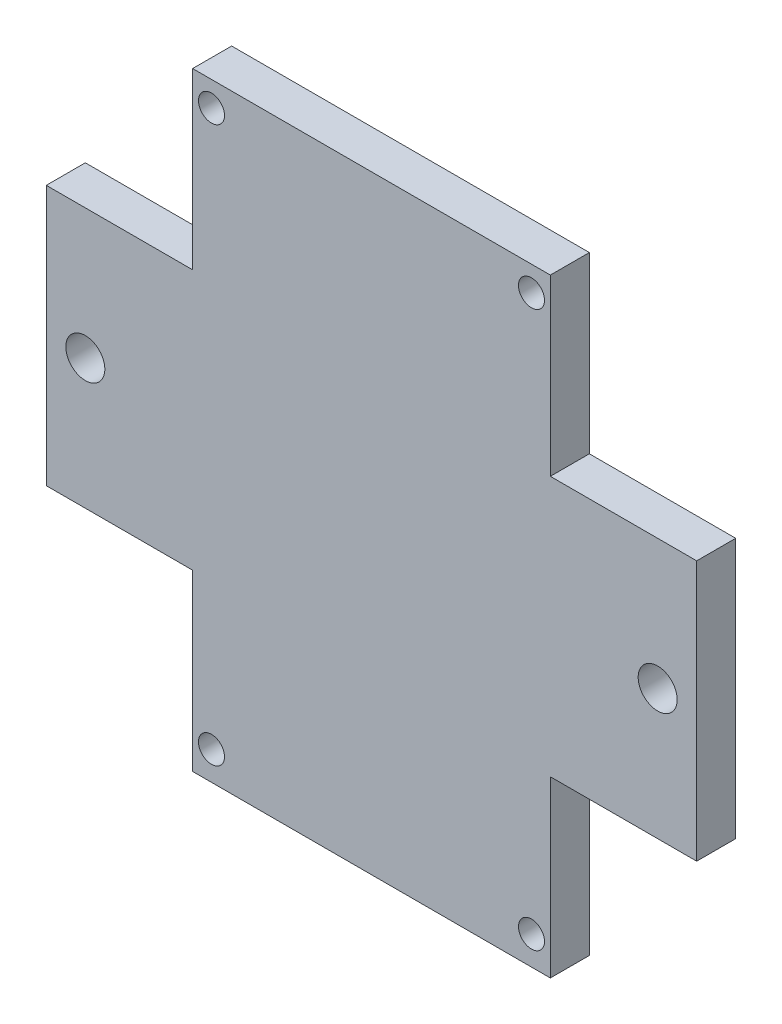
ISO-10303-21;
HEADER;
FILE_DESCRIPTION(('STEP AP214'),'2;1');
FILE_NAME('part.step','',(''),(''),'','','');
FILE_SCHEMA(('AUTOMOTIVE_DESIGN { 1 0 10303 214 1 1 1 1 }'));
ENDSEC;
DATA;
#1=APPLICATION_CONTEXT('core data for automotive mechanical design processes');
#2=APPLICATION_PROTOCOL_DEFINITION('international standard','automotive_design',2000,#1);
#3=PRODUCT_CONTEXT('',#1,'mechanical');
#4=PRODUCT('Part','Part','',(#3));
#5=PRODUCT_RELATED_PRODUCT_CATEGORY('part','',(#4));
#6=PRODUCT_DEFINITION_FORMATION('','',#4);
#7=PRODUCT_DEFINITION_CONTEXT('part definition',#1,'design');
#8=PRODUCT_DEFINITION('design','',#6,#7);
#9=PRODUCT_DEFINITION_SHAPE('','',#8);
#10=(LENGTH_UNIT() NAMED_UNIT(*) SI_UNIT(.MILLI.,.METRE.));
#11=(NAMED_UNIT(*) PLANE_ANGLE_UNIT() SI_UNIT($,.RADIAN.));
#12=(NAMED_UNIT(*) SI_UNIT($,.STERADIAN.) SOLID_ANGLE_UNIT());
#13=UNCERTAINTY_MEASURE_WITH_UNIT(LENGTH_MEASURE(1.E-05),#10,'distance_accuracy_value','');
#14=(GEOMETRIC_REPRESENTATION_CONTEXT(3) GLOBAL_UNCERTAINTY_ASSIGNED_CONTEXT((#13)) GLOBAL_UNIT_ASSIGNED_CONTEXT((#10,
#11,#12)) REPRESENTATION_CONTEXT('',''));
#15=CARTESIAN_POINT('',(0.,0.,0.));
#16=DIRECTION('',(0.,0.,1.));
#17=DIRECTION('',(1.,0.,0.));
#18=AXIS2_PLACEMENT_3D('',#15,#16,#17);
#19=CARTESIAN_POINT('',(13.75,46.8,-1.5));
#20=DIRECTION('',(-1.,0.,0.));
#21=DIRECTION('',(0.,0.,1.));
#22=AXIS2_PLACEMENT_3D('',#19,#20,#21);
#23=PLANE('',#22);
#24=DIRECTION('',(0.,-1.,0.));
#25=VECTOR('',#24,1.);
#26=CARTESIAN_POINT('',(13.75,46.8,1.5));
#27=LINE('',#26,#25);
#28=CARTESIAN_POINT('',(13.75,46.8,1.5));
#29=VERTEX_POINT('',#28);
#30=CARTESIAN_POINT('',(13.75,33.4,1.5));
#31=VERTEX_POINT('',#30);
#32=EDGE_CURVE('E225',#29,#31,#27,.T.);
#33=ORIENTED_EDGE('',*,*,#32,.T.);
#34=DIRECTION('',(0.,0.,-1.));
#35=VECTOR('',#34,1.);
#36=CARTESIAN_POINT('',(13.75,33.4,-1.5));
#37=LINE('',#36,#35);
#38=CARTESIAN_POINT('',(13.75,33.4,-1.5));
#39=VERTEX_POINT('',#38);
#40=EDGE_CURVE('E188',#31,#39,#37,.T.);
#41=ORIENTED_EDGE('',*,*,#40,.T.);
#42=DIRECTION('',(0.,-1.,0.));
#43=VECTOR('',#42,1.);
#44=CARTESIAN_POINT('',(13.75,46.8,-1.5));
#45=LINE('',#44,#43);
#46=CARTESIAN_POINT('',(13.75,46.8,-1.5));
#47=VERTEX_POINT('',#46);
#48=EDGE_CURVE('E11',#47,#39,#45,.T.);
#49=ORIENTED_EDGE('',*,*,#48,.F.);
#50=DIRECTION('',(0.,0.,-1.));
#51=VECTOR('',#50,1.);
#52=CARTESIAN_POINT('',(13.75,46.8,-1.5));
#53=LINE('',#52,#51);
#54=EDGE_CURVE('E204',#29,#47,#53,.T.);
#55=ORIENTED_EDGE('',*,*,#54,.F.);
#56=EDGE_LOOP('',(#33,#41,#49,#55));
#57=FACE_BOUND('',#56,.T.);
#58=ADVANCED_FACE('F38',(#57),#23,.F.);
#59=CARTESIAN_POINT('',(-13.75,46.8,-1.5));
#60=DIRECTION('',(1.,0.,0.));
#61=DIRECTION('',(0.,0.,-1.));
#62=AXIS2_PLACEMENT_3D('',#59,#60,#61);
#63=PLANE('',#62);
#64=DIRECTION('',(0.,-1.,0.));
#65=VECTOR('',#64,1.);
#66=CARTESIAN_POINT('',(-13.75,46.8,-1.5));
#67=LINE('',#66,#65);
#68=CARTESIAN_POINT('',(-13.75,46.8,-1.5));
#69=VERTEX_POINT('',#68);
#70=CARTESIAN_POINT('',(-13.75,33.4,-1.5));
#71=VERTEX_POINT('',#70);
#72=EDGE_CURVE('E233',#69,#71,#67,.T.);
#73=ORIENTED_EDGE('',*,*,#72,.T.);
#74=DIRECTION('',(0.,0.,1.));
#75=VECTOR('',#74,1.);
#76=CARTESIAN_POINT('',(-13.75,33.4,-1.5));
#77=LINE('',#76,#75);
#78=CARTESIAN_POINT('',(-13.75,33.4,1.5));
#79=VERTEX_POINT('',#78);
#80=EDGE_CURVE('E185',#71,#79,#77,.T.);
#81=ORIENTED_EDGE('',*,*,#80,.T.);
#82=DIRECTION('',(0.,-1.,0.));
#83=VECTOR('',#82,1.);
#84=CARTESIAN_POINT('',(-13.75,46.8,1.5));
#85=LINE('',#84,#83);
#86=CARTESIAN_POINT('',(-13.75,46.8,1.5));
#87=VERTEX_POINT('',#86);
#88=EDGE_CURVE('E229',#87,#79,#85,.T.);
#89=ORIENTED_EDGE('',*,*,#88,.F.);
#90=DIRECTION('',(0.,0.,1.));
#91=VECTOR('',#90,1.);
#92=CARTESIAN_POINT('',(-13.75,46.8,-1.5));
#93=LINE('',#92,#91);
#94=EDGE_CURVE('E210',#69,#87,#93,.T.);
#95=ORIENTED_EDGE('',*,*,#94,.F.);
#96=EDGE_LOOP('',(#73,#81,#89,#95));
#97=FACE_BOUND('',#96,.T.);
#98=ADVANCED_FACE('F294',(#97),#63,.F.);
#99=CARTESIAN_POINT('',(13.75,13.4,-1.5));
#100=VERTEX_POINT('',#99);
#101=CARTESIAN_POINT('',(13.75,0.,-1.5));
#102=VERTEX_POINT('',#101);
#103=EDGE_CURVE('E47',#100,#102,#45,.T.);
#104=ORIENTED_EDGE('',*,*,#103,.F.);
#105=DIRECTION('',(0.,0.,1.));
#106=VECTOR('',#105,1.);
#107=CARTESIAN_POINT('',(13.75,13.4,-1.5));
#108=LINE('',#107,#106);
#109=CARTESIAN_POINT('',(13.75,13.4,1.5));
#110=VERTEX_POINT('',#109);
#111=EDGE_CURVE('E183',#100,#110,#108,.T.);
#112=ORIENTED_EDGE('',*,*,#111,.T.);
#113=CARTESIAN_POINT('',(13.75,0.,1.5));
#114=VERTEX_POINT('',#113);
#115=EDGE_CURVE('E135',#110,#114,#27,.T.);
#116=ORIENTED_EDGE('',*,*,#115,.T.);
#117=DIRECTION('',(0.,0.,-1.));
#118=VECTOR('',#117,1.);
#119=CARTESIAN_POINT('',(13.75,0.,-1.5));
#120=LINE('',#119,#118);
#121=EDGE_CURVE('E214',#114,#102,#120,.T.);
#122=ORIENTED_EDGE('',*,*,#121,.T.);
#123=EDGE_LOOP('',(#104,#112,#116,#122));
#124=FACE_BOUND('',#123,.T.);
#125=ADVANCED_FACE('F40',(#124),#23,.F.);
#126=CARTESIAN_POINT('',(-13.75,46.8,-1.5));
#127=DIRECTION('',(0.,0.,1.));
#128=DIRECTION('',(1.,0.,0.));
#129=AXIS2_PLACEMENT_3D('',#126,#127,#128);
#130=PLANE('',#129);
#131=CARTESIAN_POINT('',(22.,23.4,-1.5));
#132=DIRECTION('',(0.,0.,-1.));
#133=DIRECTION('',(-1.,0.,0.));
#134=AXIS2_PLACEMENT_3D('',#131,#132,#133);
#135=CIRCLE('',#134,1.5);
#136=CARTESIAN_POINT('',(20.5,23.4,-1.5));
#137=VERTEX_POINT('',#136);
#138=EDGE_CURVE('E246',#137,#137,#135,.T.);
#139=ORIENTED_EDGE('',*,*,#138,.F.);
#140=EDGE_LOOP('',(#139));
#141=FACE_BOUND('',#140,.T.);
#142=CARTESIAN_POINT('',(-22.,23.4,-1.5));
#143=DIRECTION('',(0.,0.,-1.));
#144=DIRECTION('',(-1.,0.,0.));
#145=AXIS2_PLACEMENT_3D('',#142,#143,#144);
#146=CIRCLE('',#145,1.5);
#147=CARTESIAN_POINT('',(-23.5,23.4,-1.5));
#148=VERTEX_POINT('',#147);
#149=EDGE_CURVE('E157',#148,#148,#146,.T.);
#150=ORIENTED_EDGE('',*,*,#149,.F.);
#151=EDGE_LOOP('',(#150));
#152=FACE_BOUND('',#151,.T.);
#153=CARTESIAN_POINT('',(-12.3,2.2,-1.5));
#154=DIRECTION('',(0.,0.,-1.));
#155=DIRECTION('',(1.,0.,0.));
#156=AXIS2_PLACEMENT_3D('',#153,#154,#155);
#157=CIRCLE('',#156,1.);
#158=CARTESIAN_POINT('',(-11.3,2.2,-1.5));
#159=VERTEX_POINT('',#158);
#160=EDGE_CURVE('E196',#159,#159,#157,.T.);
#161=ORIENTED_EDGE('',*,*,#160,.F.);
#162=EDGE_LOOP('',(#161));
#163=FACE_BOUND('',#162,.T.);
#164=CARTESIAN_POINT('',(12.3,2.2,-1.5));
#165=DIRECTION('',(0.,0.,-1.));
#166=DIRECTION('',(-1.,0.,0.));
#167=AXIS2_PLACEMENT_3D('',#164,#165,#166);
#168=CIRCLE('',#167,1.);
#169=CARTESIAN_POINT('',(11.3,2.2,-1.5));
#170=VERTEX_POINT('',#169);
#171=EDGE_CURVE('E192',#170,#170,#168,.T.);
#172=ORIENTED_EDGE('',*,*,#171,.F.);
#173=EDGE_LOOP('',(#172));
#174=FACE_BOUND('',#173,.T.);
#175=CARTESIAN_POINT('',(-13.75,13.4,-1.5));
#176=VERTEX_POINT('',#175);
#177=CARTESIAN_POINT('',(-13.75,0.,-1.5));
#178=VERTEX_POINT('',#177);
#179=EDGE_CURVE('E232',#176,#178,#67,.T.);
#180=ORIENTED_EDGE('',*,*,#179,.F.);
#181=DIRECTION('',(1.,0.,0.));
#182=VECTOR('',#181,1.);
#183=CARTESIAN_POINT('',(-25.,13.4,-1.5));
#184=LINE('',#183,#182);
#185=CARTESIAN_POINT('',(-25.,13.4,-1.5));
#186=VERTEX_POINT('',#185);
#187=EDGE_CURVE('E55',#186,#176,#184,.T.);
#188=ORIENTED_EDGE('',*,*,#187,.F.);
#189=DIRECTION('',(0.,1.,0.));
#190=VECTOR('',#189,1.);
#191=CARTESIAN_POINT('',(-25.,33.4,-1.5));
#192=LINE('',#191,#190);
#193=CARTESIAN_POINT('',(-25.,33.4,-1.5));
#194=VERTEX_POINT('',#193);
#195=EDGE_CURVE('E167',#186,#194,#192,.T.);
#196=ORIENTED_EDGE('',*,*,#195,.T.);
#197=DIRECTION('',(1.,0.,0.));
#198=VECTOR('',#197,1.);
#199=CARTESIAN_POINT('',(-25.,33.4,-1.5));
#200=LINE('',#199,#198);
#201=EDGE_CURVE('E176',#194,#71,#200,.T.);
#202=ORIENTED_EDGE('',*,*,#201,.T.);
#203=ORIENTED_EDGE('',*,*,#72,.F.);
#204=DIRECTION('',(-1.,0.,0.));
#205=VECTOR('',#204,1.);
#206=CARTESIAN_POINT('',(-13.75,46.8,-1.5));
#207=LINE('',#206,#205);
#208=EDGE_CURVE('E207',#47,#69,#207,.T.);
#209=ORIENTED_EDGE('',*,*,#208,.F.);
#210=ORIENTED_EDGE('',*,*,#48,.T.);
#211=CARTESIAN_POINT('',(25.,33.4,-1.5));
#212=VERTEX_POINT('',#211);
#213=EDGE_CURVE('E179',#39,#212,#200,.T.);
#214=ORIENTED_EDGE('',*,*,#213,.T.);
#215=DIRECTION('',(0.,1.,0.));
#216=VECTOR('',#215,1.);
#217=CARTESIAN_POINT('',(25.,33.4,-1.5));
#218=LINE('',#217,#216);
#219=CARTESIAN_POINT('',(25.,13.4,-1.5));
#220=VERTEX_POINT('',#219);
#221=EDGE_CURVE('E147',#220,#212,#218,.T.);
#222=ORIENTED_EDGE('',*,*,#221,.F.);
#223=EDGE_CURVE('E143',#100,#220,#184,.T.);
#224=ORIENTED_EDGE('',*,*,#223,.F.);
#225=ORIENTED_EDGE('',*,*,#103,.T.);
#226=DIRECTION('',(-1.,0.,0.));
#227=VECTOR('',#226,1.);
#228=CARTESIAN_POINT('',(-13.75,0.,-1.5));
#229=LINE('',#228,#227);
#230=EDGE_CURVE('E217',#102,#178,#229,.T.);
#231=ORIENTED_EDGE('',*,*,#230,.T.);
#232=EDGE_LOOP('',(#180,#188,#196,#202,#203,#209,#210,#214,#222,#224,#225,#231));
#233=FACE_BOUND('',#232,.T.);
#234=CARTESIAN_POINT('',(12.3,44.8931165616626,-1.5));
#235=DIRECTION('',(0.,0.,-1.));
#236=DIRECTION('',(-1.,0.,0.));
#237=AXIS2_PLACEMENT_3D('',#234,#235,#236);
#238=CIRCLE('',#237,1.);
#239=CARTESIAN_POINT('',(11.3,44.8931165616626,-1.5));
#240=VERTEX_POINT('',#239);
#241=EDGE_CURVE('E195',#240,#240,#238,.T.);
#242=ORIENTED_EDGE('',*,*,#241,.F.);
#243=EDGE_LOOP('',(#242));
#244=FACE_BOUND('',#243,.T.);
#245=CARTESIAN_POINT('',(-12.3,44.8931165616626,-1.5));
#246=DIRECTION('',(0.,0.,-1.));
#247=DIRECTION('',(1.,0.,0.));
#248=AXIS2_PLACEMENT_3D('',#245,#246,#247);
#249=CIRCLE('',#248,1.);
#250=CARTESIAN_POINT('',(-11.3,44.8931165616626,-1.5));
#251=VERTEX_POINT('',#250);
#252=EDGE_CURVE('E191',#251,#251,#249,.T.);
#253=ORIENTED_EDGE('',*,*,#252,.F.);
#254=EDGE_LOOP('',(#253));
#255=FACE_BOUND('',#254,.T.);
#256=ADVANCED_FACE('F258',(#141,#152,#163,#174,#233,#244,#255),#130,.F.);
#257=CARTESIAN_POINT('',(-13.75,13.4,1.5));
#258=VERTEX_POINT('',#257);
#259=CARTESIAN_POINT('',(-13.75,0.,1.5));
#260=VERTEX_POINT('',#259);
#261=EDGE_CURVE('E228',#258,#260,#85,.T.);
#262=ORIENTED_EDGE('',*,*,#261,.F.);
#263=DIRECTION('',(0.,0.,-1.));
#264=VECTOR('',#263,1.);
#265=CARTESIAN_POINT('',(-13.75,13.4,-1.5));
#266=LINE('',#265,#264);
#267=EDGE_CURVE('E174',#258,#176,#266,.T.);
#268=ORIENTED_EDGE('',*,*,#267,.T.);
#269=ORIENTED_EDGE('',*,*,#179,.T.);
#270=DIRECTION('',(0.,0.,1.));
#271=VECTOR('',#270,1.);
#272=CARTESIAN_POINT('',(-13.75,0.,-1.5));
#273=LINE('',#272,#271);
#274=EDGE_CURVE('E221',#178,#260,#273,.T.);
#275=ORIENTED_EDGE('',*,*,#274,.T.);
#276=EDGE_LOOP('',(#262,#268,#269,#275));
#277=FACE_BOUND('',#276,.T.);
#278=ADVANCED_FACE('F261',(#277),#63,.F.);
#279=CARTESIAN_POINT('',(-13.75,46.8,1.5));
#280=DIRECTION('',(0.,0.,-1.));
#281=DIRECTION('',(-1.,0.,0.));
#282=AXIS2_PLACEMENT_3D('',#279,#280,#281);
#283=PLANE('',#282);
#284=CARTESIAN_POINT('',(22.,23.4,1.5));
#285=DIRECTION('',(0.,0.,-1.));
#286=DIRECTION('',(-1.,0.,0.));
#287=AXIS2_PLACEMENT_3D('',#284,#285,#286);
#288=CIRCLE('',#287,1.5);
#289=CARTESIAN_POINT('',(20.5,23.4,1.5));
#290=VERTEX_POINT('',#289);
#291=EDGE_CURVE('E42',#290,#290,#288,.T.);
#292=ORIENTED_EDGE('',*,*,#291,.T.);
#293=EDGE_LOOP('',(#292));
#294=FACE_BOUND('',#293,.T.);
#295=CARTESIAN_POINT('',(-22.,23.4,1.5));
#296=DIRECTION('',(0.,0.,-1.));
#297=DIRECTION('',(-1.,0.,0.));
#298=AXIS2_PLACEMENT_3D('',#295,#296,#297);
#299=CIRCLE('',#298,1.5);
#300=CARTESIAN_POINT('',(-23.5,23.4,1.5));
#301=VERTEX_POINT('',#300);
#302=EDGE_CURVE('E155',#301,#301,#299,.T.);
#303=ORIENTED_EDGE('',*,*,#302,.T.);
#304=EDGE_LOOP('',(#303));
#305=FACE_BOUND('',#304,.T.);
#306=CARTESIAN_POINT('',(-12.3,2.2,1.5));
#307=DIRECTION('',(0.,0.,-1.));
#308=DIRECTION('',(-1.,0.,0.));
#309=AXIS2_PLACEMENT_3D('',#306,#307,#308);
#310=CIRCLE('',#309,1.);
#311=CARTESIAN_POINT('',(-13.3,2.2,1.5));
#312=VERTEX_POINT('',#311);
#313=EDGE_CURVE('E241',#312,#312,#310,.T.);
#314=ORIENTED_EDGE('',*,*,#313,.T.);
#315=EDGE_LOOP('',(#314));
#316=FACE_BOUND('',#315,.T.);
#317=CARTESIAN_POINT('',(12.3,2.2,1.5));
#318=DIRECTION('',(0.,0.,-1.));
#319=DIRECTION('',(-1.,0.,0.));
#320=AXIS2_PLACEMENT_3D('',#317,#318,#319);
#321=CIRCLE('',#320,1.);
#322=CARTESIAN_POINT('',(11.3,2.2,1.5));
#323=VERTEX_POINT('',#322);
#324=EDGE_CURVE('E238',#323,#323,#321,.T.);
#325=ORIENTED_EDGE('',*,*,#324,.T.);
#326=EDGE_LOOP('',(#325));
#327=FACE_BOUND('',#326,.T.);
#328=ORIENTED_EDGE('',*,*,#115,.F.);
#329=DIRECTION('',(1.,0.,0.));
#330=VECTOR('',#329,1.);
#331=CARTESIAN_POINT('',(-25.,13.4,1.5));
#332=LINE('',#331,#330);
#333=CARTESIAN_POINT('',(25.,13.4,1.5));
#334=VERTEX_POINT('',#333);
#335=EDGE_CURVE('E63',#110,#334,#332,.T.);
#336=ORIENTED_EDGE('',*,*,#335,.T.);
#337=DIRECTION('',(0.,-1.,0.));
#338=VECTOR('',#337,1.);
#339=CARTESIAN_POINT('',(25.,33.4,1.5));
#340=LINE('',#339,#338);
#341=CARTESIAN_POINT('',(25.,33.4,1.5));
#342=VERTEX_POINT('',#341);
#343=EDGE_CURVE('E133',#342,#334,#340,.T.);
#344=ORIENTED_EDGE('',*,*,#343,.F.);
#345=DIRECTION('',(1.,0.,0.));
#346=VECTOR('',#345,1.);
#347=CARTESIAN_POINT('',(-25.,33.4,1.5));
#348=LINE('',#347,#346);
#349=EDGE_CURVE('E175',#31,#342,#348,.T.);
#350=ORIENTED_EDGE('',*,*,#349,.F.);
#351=ORIENTED_EDGE('',*,*,#32,.F.);
#352=DIRECTION('',(1.,0.,0.));
#353=VECTOR('',#352,1.);
#354=CARTESIAN_POINT('',(-13.75,46.8,1.5));
#355=LINE('',#354,#353);
#356=EDGE_CURVE('E212',#87,#29,#355,.T.);
#357=ORIENTED_EDGE('',*,*,#356,.F.);
#358=ORIENTED_EDGE('',*,*,#88,.T.);
#359=CARTESIAN_POINT('',(-25.,33.4,1.5));
#360=VERTEX_POINT('',#359);
#361=EDGE_CURVE('E172',#360,#79,#348,.T.);
#362=ORIENTED_EDGE('',*,*,#361,.F.);
#363=DIRECTION('',(0.,-1.,0.));
#364=VECTOR('',#363,1.);
#365=CARTESIAN_POINT('',(-25.,33.4,1.5));
#366=LINE('',#365,#364);
#367=CARTESIAN_POINT('',(-25.,13.4,1.5));
#368=VERTEX_POINT('',#367);
#369=EDGE_CURVE('E162',#360,#368,#366,.T.);
#370=ORIENTED_EDGE('',*,*,#369,.T.);
#371=EDGE_CURVE('E136',#368,#258,#332,.T.);
#372=ORIENTED_EDGE('',*,*,#371,.T.);
#373=ORIENTED_EDGE('',*,*,#261,.T.);
#374=DIRECTION('',(1.,0.,0.));
#375=VECTOR('',#374,1.);
#376=CARTESIAN_POINT('',(-13.75,0.,1.5));
#377=LINE('',#376,#375);
#378=EDGE_CURVE('E208',#260,#114,#377,.T.);
#379=ORIENTED_EDGE('',*,*,#378,.T.);
#380=EDGE_LOOP('',(#328,#336,#344,#350,#351,#357,#358,#362,#370,#372,#373,#379));
#381=FACE_BOUND('',#380,.T.);
#382=CARTESIAN_POINT('',(12.3,44.8931165616626,1.5));
#383=DIRECTION('',(0.,0.,-1.));
#384=DIRECTION('',(-1.,0.,0.));
#385=AXIS2_PLACEMENT_3D('',#382,#383,#384);
#386=CIRCLE('',#385,1.);
#387=CARTESIAN_POINT('',(11.3,44.8931165616626,1.5));
#388=VERTEX_POINT('',#387);
#389=EDGE_CURVE('E203',#388,#388,#386,.T.);
#390=ORIENTED_EDGE('',*,*,#389,.T.);
#391=EDGE_LOOP('',(#390));
#392=FACE_BOUND('',#391,.T.);
#393=CARTESIAN_POINT('',(-12.3,44.8931165616626,1.5));
#394=DIRECTION('',(0.,0.,-1.));
#395=DIRECTION('',(-1.,0.,0.));
#396=AXIS2_PLACEMENT_3D('',#393,#394,#395);
#397=CIRCLE('',#396,1.);
#398=CARTESIAN_POINT('',(-13.3,44.8931165616626,1.5));
#399=VERTEX_POINT('',#398);
#400=EDGE_CURVE('E218',#399,#399,#397,.T.);
#401=ORIENTED_EDGE('',*,*,#400,.T.);
#402=EDGE_LOOP('',(#401));
#403=FACE_BOUND('',#402,.T.);
#404=ADVANCED_FACE('F129',(#294,#305,#316,#327,#381,#392,#403),#283,.F.);
#405=CARTESIAN_POINT('',(0.,46.8,0.));
#406=DIRECTION('',(0.,1.,0.));
#407=DIRECTION('',(0.,0.,1.));
#408=AXIS2_PLACEMENT_3D('',#405,#406,#407);
#409=PLANE('',#408);
#410=ORIENTED_EDGE('',*,*,#54,.T.);
#411=ORIENTED_EDGE('',*,*,#208,.T.);
#412=ORIENTED_EDGE('',*,*,#94,.T.);
#413=ORIENTED_EDGE('',*,*,#356,.T.);
#414=EDGE_LOOP('',(#410,#411,#412,#413));
#415=FACE_BOUND('',#414,.T.);
#416=ADVANCED_FACE('F282',(#415),#409,.T.);
#417=CARTESIAN_POINT('',(0.,0.,0.));
#418=DIRECTION('',(0.,1.,0.));
#419=DIRECTION('',(0.,0.,1.));
#420=AXIS2_PLACEMENT_3D('',#417,#418,#419);
#421=PLANE('',#420);
#422=ORIENTED_EDGE('',*,*,#121,.F.);
#423=ORIENTED_EDGE('',*,*,#378,.F.);
#424=ORIENTED_EDGE('',*,*,#274,.F.);
#425=ORIENTED_EDGE('',*,*,#230,.F.);
#426=EDGE_LOOP('',(#422,#423,#424,#425));
#427=FACE_BOUND('',#426,.T.);
#428=ADVANCED_FACE('F289',(#427),#421,.F.);
#429=CARTESIAN_POINT('',(12.3,44.8931165616626,45.3));
#430=DIRECTION('',(0.,0.,-1.));
#431=DIRECTION('',(-1.,0.,0.));
#432=AXIS2_PLACEMENT_3D('',#429,#430,#431);
#433=CYLINDRICAL_SURFACE('',#432,1.);
#434=ORIENTED_EDGE('',*,*,#241,.T.);
#435=EDGE_LOOP('',(#434));
#436=FACE_BOUND('',#435,.T.);
#437=ORIENTED_EDGE('',*,*,#389,.F.);
#438=EDGE_LOOP('',(#437));
#439=FACE_BOUND('',#438,.T.);
#440=ADVANCED_FACE('F343',(#436,#439),#433,.F.);
#441=CARTESIAN_POINT('',(12.3,2.2,45.3));
#442=DIRECTION('',(0.,0.,-1.));
#443=DIRECTION('',(-1.,0.,0.));
#444=AXIS2_PLACEMENT_3D('',#441,#442,#443);
#445=CYLINDRICAL_SURFACE('',#444,1.);
#446=ORIENTED_EDGE('',*,*,#171,.T.);
#447=EDGE_LOOP('',(#446));
#448=FACE_BOUND('',#447,.T.);
#449=ORIENTED_EDGE('',*,*,#324,.F.);
#450=EDGE_LOOP('',(#449));
#451=FACE_BOUND('',#450,.T.);
#452=ADVANCED_FACE('F340',(#448,#451),#445,.F.);
#453=CARTESIAN_POINT('',(-12.3,2.2,45.3));
#454=DIRECTION('',(0.,0.,-1.));
#455=DIRECTION('',(-1.,0.,0.));
#456=AXIS2_PLACEMENT_3D('',#453,#454,#455);
#457=CYLINDRICAL_SURFACE('',#456,1.);
#458=ORIENTED_EDGE('',*,*,#160,.T.);
#459=EDGE_LOOP('',(#458));
#460=FACE_BOUND('',#459,.T.);
#461=ORIENTED_EDGE('',*,*,#313,.F.);
#462=EDGE_LOOP('',(#461));
#463=FACE_BOUND('',#462,.T.);
#464=ADVANCED_FACE('F277',(#460,#463),#457,.F.);
#465=CARTESIAN_POINT('',(-12.3,44.8931165616626,45.3));
#466=DIRECTION('',(0.,0.,-1.));
#467=DIRECTION('',(-1.,0.,0.));
#468=AXIS2_PLACEMENT_3D('',#465,#466,#467);
#469=CYLINDRICAL_SURFACE('',#468,1.);
#470=ORIENTED_EDGE('',*,*,#252,.T.);
#471=EDGE_LOOP('',(#470));
#472=FACE_BOUND('',#471,.T.);
#473=ORIENTED_EDGE('',*,*,#400,.F.);
#474=EDGE_LOOP('',(#473));
#475=FACE_BOUND('',#474,.T.);
#476=ADVANCED_FACE('F273',(#472,#475),#469,.F.);
#477=CARTESIAN_POINT('',(-25.,0.,0.));
#478=DIRECTION('',(1.,0.,0.));
#479=DIRECTION('',(0.,0.,-1.));
#480=AXIS2_PLACEMENT_3D('',#477,#478,#479);
#481=PLANE('',#480);
#482=ORIENTED_EDGE('',*,*,#369,.F.);
#483=DIRECTION('',(0.,0.,1.));
#484=VECTOR('',#483,1.);
#485=CARTESIAN_POINT('',(-25.,33.4,1.5));
#486=LINE('',#485,#484);
#487=EDGE_CURVE('E137',#194,#360,#486,.T.);
#488=ORIENTED_EDGE('',*,*,#487,.F.);
#489=ORIENTED_EDGE('',*,*,#195,.F.);
#490=DIRECTION('',(0.,0.,-1.));
#491=VECTOR('',#490,1.);
#492=CARTESIAN_POINT('',(-25.,13.4,1.5));
#493=LINE('',#492,#491);
#494=EDGE_CURVE('E165',#368,#186,#493,.T.);
#495=ORIENTED_EDGE('',*,*,#494,.F.);
#496=EDGE_LOOP('',(#482,#488,#489,#495));
#497=FACE_BOUND('',#496,.T.);
#498=ADVANCED_FACE('F276',(#497),#481,.F.);
#499=CARTESIAN_POINT('',(-25.,13.4,1.5));
#500=DIRECTION('',(0.,-1.,0.));
#501=DIRECTION('',(0.,0.,-1.));
#502=AXIS2_PLACEMENT_3D('',#499,#500,#501);
#503=PLANE('',#502);
#504=ORIENTED_EDGE('',*,*,#267,.F.);
#505=ORIENTED_EDGE('',*,*,#371,.F.);
#506=ORIENTED_EDGE('',*,*,#494,.T.);
#507=ORIENTED_EDGE('',*,*,#187,.T.);
#508=EDGE_LOOP('',(#504,#505,#506,#507));
#509=FACE_BOUND('',#508,.T.);
#510=ADVANCED_FACE('F313',(#509),#503,.T.);
#511=CARTESIAN_POINT('',(-25.,33.4,1.5));
#512=DIRECTION('',(0.,1.,0.));
#513=DIRECTION('',(0.,0.,1.));
#514=AXIS2_PLACEMENT_3D('',#511,#512,#513);
#515=PLANE('',#514);
#516=ORIENTED_EDGE('',*,*,#80,.F.);
#517=ORIENTED_EDGE('',*,*,#201,.F.);
#518=ORIENTED_EDGE('',*,*,#487,.T.);
#519=ORIENTED_EDGE('',*,*,#361,.T.);
#520=EDGE_LOOP('',(#516,#517,#518,#519));
#521=FACE_BOUND('',#520,.T.);
#522=ADVANCED_FACE('F320',(#521),#515,.T.);
#523=ORIENTED_EDGE('',*,*,#40,.F.);
#524=ORIENTED_EDGE('',*,*,#349,.T.);
#525=DIRECTION('',(0.,0.,1.));
#526=VECTOR('',#525,1.);
#527=CARTESIAN_POINT('',(25.,33.4,1.5));
#528=LINE('',#527,#526);
#529=EDGE_CURVE('E152',#212,#342,#528,.T.);
#530=ORIENTED_EDGE('',*,*,#529,.F.);
#531=ORIENTED_EDGE('',*,*,#213,.F.);
#532=EDGE_LOOP('',(#523,#524,#530,#531));
#533=FACE_BOUND('',#532,.T.);
#534=ADVANCED_FACE('F329',(#533),#515,.T.);
#535=ORIENTED_EDGE('',*,*,#111,.F.);
#536=ORIENTED_EDGE('',*,*,#223,.T.);
#537=DIRECTION('',(0.,0.,-1.));
#538=VECTOR('',#537,1.);
#539=CARTESIAN_POINT('',(25.,13.4,1.5));
#540=LINE('',#539,#538);
#541=EDGE_CURVE('E140',#334,#220,#540,.T.);
#542=ORIENTED_EDGE('',*,*,#541,.F.);
#543=ORIENTED_EDGE('',*,*,#335,.F.);
#544=EDGE_LOOP('',(#535,#536,#542,#543));
#545=FACE_BOUND('',#544,.T.);
#546=ADVANCED_FACE('F141',(#545),#503,.T.);
#547=CARTESIAN_POINT('',(25.,0.,0.));
#548=DIRECTION('',(1.,0.,0.));
#549=DIRECTION('',(0.,0.,-1.));
#550=AXIS2_PLACEMENT_3D('',#547,#548,#549);
#551=PLANE('',#550);
#552=ORIENTED_EDGE('',*,*,#343,.T.);
#553=ORIENTED_EDGE('',*,*,#541,.T.);
#554=ORIENTED_EDGE('',*,*,#221,.T.);
#555=ORIENTED_EDGE('',*,*,#529,.T.);
#556=EDGE_LOOP('',(#552,#553,#554,#555));
#557=FACE_BOUND('',#556,.T.);
#558=ADVANCED_FACE('F150',(#557),#551,.T.);
#559=CARTESIAN_POINT('',(-22.,23.4,23.5));
#560=DIRECTION('',(0.,0.,-1.));
#561=DIRECTION('',(-1.,0.,0.));
#562=AXIS2_PLACEMENT_3D('',#559,#560,#561);
#563=CYLINDRICAL_SURFACE('',#562,1.5);
#564=ORIENTED_EDGE('',*,*,#149,.T.);
#565=EDGE_LOOP('',(#564));
#566=FACE_BOUND('',#565,.T.);
#567=ORIENTED_EDGE('',*,*,#302,.F.);
#568=EDGE_LOOP('',(#567));
#569=FACE_BOUND('',#568,.T.);
#570=ADVANCED_FACE('F255',(#566,#569),#563,.F.);
#571=CARTESIAN_POINT('',(22.,23.4,23.5));
#572=DIRECTION('',(0.,0.,-1.));
#573=DIRECTION('',(-1.,0.,0.));
#574=AXIS2_PLACEMENT_3D('',#571,#572,#573);
#575=CYLINDRICAL_SURFACE('',#574,1.5);
#576=ORIENTED_EDGE('',*,*,#138,.T.);
#577=EDGE_LOOP('',(#576));
#578=FACE_BOUND('',#577,.T.);
#579=ORIENTED_EDGE('',*,*,#291,.F.);
#580=EDGE_LOOP('',(#579));
#581=FACE_BOUND('',#580,.T.);
#582=ADVANCED_FACE('F429',(#578,#581),#575,.F.);
#583=CLOSED_SHELL('',(#58,#98,#125,#256,#278,#404,#416,#428,#440,#452,#464,#476,#498,#510,#522,
#534,#546,#558,#570,#582));
#584=MANIFOLD_SOLID_BREP('B2',#583);
#585=ADVANCED_BREP_SHAPE_REPRESENTATION('',(#18,#584),#14);
#586=SHAPE_DEFINITION_REPRESENTATION(#9,#585);
ENDSEC;
END-ISO-10303-21;
